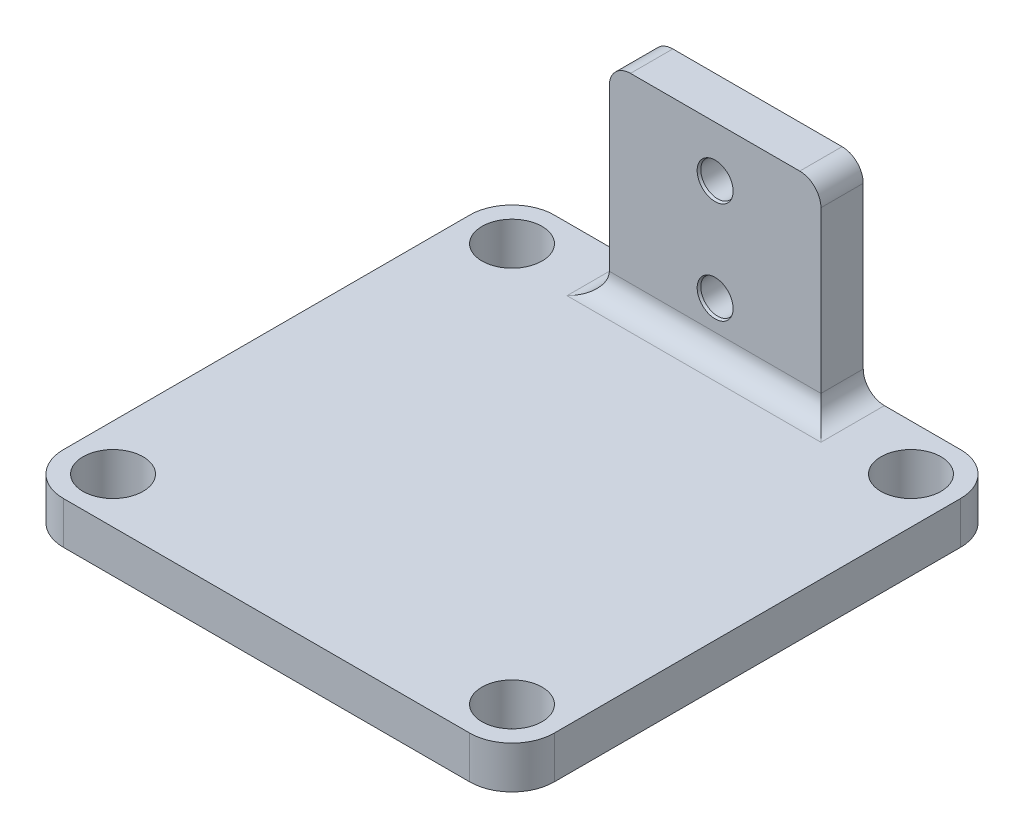
ISO-10303-21;
HEADER;
FILE_DESCRIPTION(('STEP AP214'),'2;1');
FILE_NAME('part.step','',(''),(''),'','','');
FILE_SCHEMA(('AUTOMOTIVE_DESIGN { 1 0 10303 214 1 1 1 1 }'));
ENDSEC;
DATA;
#1=APPLICATION_CONTEXT('core data for automotive mechanical design processes');
#2=APPLICATION_PROTOCOL_DEFINITION('international standard','automotive_design',2000,#1);
#3=PRODUCT_CONTEXT('',#1,'mechanical');
#4=PRODUCT('Part','Part','',(#3));
#5=PRODUCT_RELATED_PRODUCT_CATEGORY('part','',(#4));
#6=PRODUCT_DEFINITION_FORMATION('','',#4);
#7=PRODUCT_DEFINITION_CONTEXT('part definition',#1,'design');
#8=PRODUCT_DEFINITION('design','',#6,#7);
#9=PRODUCT_DEFINITION_SHAPE('','',#8);
#10=(LENGTH_UNIT() NAMED_UNIT(*) SI_UNIT(.MILLI.,.METRE.));
#11=(NAMED_UNIT(*) PLANE_ANGLE_UNIT() SI_UNIT($,.RADIAN.));
#12=(NAMED_UNIT(*) SI_UNIT($,.STERADIAN.) SOLID_ANGLE_UNIT());
#13=UNCERTAINTY_MEASURE_WITH_UNIT(LENGTH_MEASURE(1.E-05),#10,'distance_accuracy_value','');
#14=(GEOMETRIC_REPRESENTATION_CONTEXT(3) GLOBAL_UNCERTAINTY_ASSIGNED_CONTEXT((#13)) GLOBAL_UNIT_ASSIGNED_CONTEXT((#10,
#11,#12)) REPRESENTATION_CONTEXT('',''));
#15=CARTESIAN_POINT('',(0.,0.,0.));
#16=DIRECTION('',(0.,0.,1.));
#17=DIRECTION('',(1.,0.,0.));
#18=AXIS2_PLACEMENT_3D('',#15,#16,#17);
#19=CARTESIAN_POINT('',(0.,5.,0.));
#20=DIRECTION('',(0.,-1.,0.));
#21=DIRECTION('',(0.,0.,-1.));
#22=AXIS2_PLACEMENT_3D('',#19,#20,#21);
#23=PLANE('',#22);
#24=CARTESIAN_POINT('',(-23.57,5.,23.57));
#25=DIRECTION('',(0.,1.,0.));
#26=DIRECTION('',(0.,0.,1.));
#27=AXIS2_PLACEMENT_3D('',#24,#25,#26);
#28=CIRCLE('',#27,3.55);
#29=CARTESIAN_POINT('',(-23.57,5.,27.12));
#30=VERTEX_POINT('',#29);
#31=EDGE_CURVE('E303',#30,#30,#28,.T.);
#32=ORIENTED_EDGE('',*,*,#31,.F.);
#33=EDGE_LOOP('',(#32));
#34=FACE_BOUND('',#33,.T.);
#35=CARTESIAN_POINT('',(23.57,5.,23.57));
#36=DIRECTION('',(0.,1.,0.));
#37=DIRECTION('',(0.,0.,1.));
#38=AXIS2_PLACEMENT_3D('',#35,#36,#37);
#39=CIRCLE('',#38,3.55);
#40=CARTESIAN_POINT('',(23.57,5.,27.12));
#41=VERTEX_POINT('',#40);
#42=EDGE_CURVE('E309',#41,#41,#39,.T.);
#43=ORIENTED_EDGE('',*,*,#42,.F.);
#44=EDGE_LOOP('',(#43));
#45=FACE_BOUND('',#44,.T.);
#46=CARTESIAN_POINT('',(23.57,5.,-23.57));
#47=DIRECTION('',(0.,1.,0.));
#48=DIRECTION('',(0.,0.,1.));
#49=AXIS2_PLACEMENT_3D('',#46,#47,#48);
#50=CIRCLE('',#49,3.55);
#51=CARTESIAN_POINT('',(23.57,5.,-20.02));
#52=VERTEX_POINT('',#51);
#53=EDGE_CURVE('E315',#52,#52,#50,.T.);
#54=ORIENTED_EDGE('',*,*,#53,.F.);
#55=EDGE_LOOP('',(#54));
#56=FACE_BOUND('',#55,.T.);
#57=CARTESIAN_POINT('',(-23.57,5.,-23.57));
#58=DIRECTION('',(0.,1.,0.));
#59=DIRECTION('',(0.,0.,1.));
#60=AXIS2_PLACEMENT_3D('',#57,#58,#59);
#61=CIRCLE('',#60,3.55);
#62=CARTESIAN_POINT('',(-23.57,5.,-20.02));
#63=VERTEX_POINT('',#62);
#64=EDGE_CURVE('E194',#63,#63,#61,.T.);
#65=ORIENTED_EDGE('',*,*,#64,.F.);
#66=EDGE_LOOP('',(#65));
#67=FACE_BOUND('',#66,.T.);
#68=DIRECTION('',(-1.,0.,0.));
#69=VECTOR('',#68,1.);
#70=CARTESIAN_POINT('',(-29.,5.,-29.));
#71=LINE('',#70,#69);
#72=CARTESIAN_POINT('',(24.,5.,-29.));
#73=VERTEX_POINT('',#72);
#74=CARTESIAN_POINT('',(15.,5.,-29.));
#75=VERTEX_POINT('',#74);
#76=EDGE_CURVE('E181',#73,#75,#71,.T.);
#77=ORIENTED_EDGE('',*,*,#76,.T.);
#78=DIRECTION('',(0.,0.,-1.));
#79=VECTOR('',#78,1.);
#80=CARTESIAN_POINT('',(15.,5.,-24.));
#81=LINE('',#80,#79);
#82=CARTESIAN_POINT('',(15.,5.,-21.5));
#83=VERTEX_POINT('',#82);
#84=EDGE_CURVE('E239',#75,#83,#81,.F.);
#85=ORIENTED_EDGE('',*,*,#84,.T.);
#86=DIRECTION('',(1.,0.,0.));
#87=VECTOR('',#86,1.);
#88=CARTESIAN_POINT('',(0.,5.,-21.5));
#89=LINE('',#88,#87);
#90=CARTESIAN_POINT('',(-15.,5.,-21.5));
#91=VERTEX_POINT('',#90);
#92=EDGE_CURVE('E237',#83,#91,#89,.F.);
#93=ORIENTED_EDGE('',*,*,#92,.T.);
#94=DIRECTION('',(0.,0.,-1.));
#95=VECTOR('',#94,1.);
#96=CARTESIAN_POINT('',(-15.,5.,-29.));
#97=LINE('',#96,#95);
#98=CARTESIAN_POINT('',(-15.,5.,-29.));
#99=VERTEX_POINT('',#98);
#100=EDGE_CURVE('E235',#91,#99,#97,.T.);
#101=ORIENTED_EDGE('',*,*,#100,.T.);
#102=CARTESIAN_POINT('',(-24.,5.,-29.));
#103=VERTEX_POINT('',#102);
#104=EDGE_CURVE('E327',#99,#103,#71,.T.);
#105=ORIENTED_EDGE('',*,*,#104,.T.);
#106=CARTESIAN_POINT('',(-24.,5.,-24.));
#107=DIRECTION('',(0.,-1.,0.));
#108=DIRECTION('',(0.,0.,-1.));
#109=AXIS2_PLACEMENT_3D('',#106,#107,#108);
#110=CIRCLE('',#109,5.);
#111=CARTESIAN_POINT('',(-29.,5.,-24.));
#112=VERTEX_POINT('',#111);
#113=EDGE_CURVE('E214',#103,#112,#110,.F.);
#114=ORIENTED_EDGE('',*,*,#113,.T.);
#115=DIRECTION('',(0.,0.,1.));
#116=VECTOR('',#115,1.);
#117=CARTESIAN_POINT('',(-29.,5.,29.));
#118=LINE('',#117,#116);
#119=CARTESIAN_POINT('',(-29.,5.,24.));
#120=VERTEX_POINT('',#119);
#121=EDGE_CURVE('E329',#112,#120,#118,.T.);
#122=ORIENTED_EDGE('',*,*,#121,.T.);
#123=CARTESIAN_POINT('',(-24.,5.,24.));
#124=DIRECTION('',(0.,-1.,0.));
#125=DIRECTION('',(0.,0.,-1.));
#126=AXIS2_PLACEMENT_3D('',#123,#124,#125);
#127=CIRCLE('',#126,5.);
#128=CARTESIAN_POINT('',(-24.,5.,29.));
#129=VERTEX_POINT('',#128);
#130=EDGE_CURVE('E210',#120,#129,#127,.F.);
#131=ORIENTED_EDGE('',*,*,#130,.T.);
#132=DIRECTION('',(1.,0.,0.));
#133=VECTOR('',#132,1.);
#134=CARTESIAN_POINT('',(-29.,5.,29.));
#135=LINE('',#134,#133);
#136=CARTESIAN_POINT('',(24.,5.,29.));
#137=VERTEX_POINT('',#136);
#138=EDGE_CURVE('E201',#129,#137,#135,.T.);
#139=ORIENTED_EDGE('',*,*,#138,.T.);
#140=CARTESIAN_POINT('',(24.,5.,24.));
#141=DIRECTION('',(0.,-1.,0.));
#142=DIRECTION('',(0.,0.,-1.));
#143=AXIS2_PLACEMENT_3D('',#140,#141,#142);
#144=CIRCLE('',#143,5.);
#145=CARTESIAN_POINT('',(29.,5.,24.));
#146=VERTEX_POINT('',#145);
#147=EDGE_CURVE('E212',#137,#146,#144,.F.);
#148=ORIENTED_EDGE('',*,*,#147,.T.);
#149=DIRECTION('',(0.,0.,-1.));
#150=VECTOR('',#149,1.);
#151=CARTESIAN_POINT('',(29.,5.,29.));
#152=LINE('',#151,#150);
#153=CARTESIAN_POINT('',(29.,5.,-24.));
#154=VERTEX_POINT('',#153);
#155=EDGE_CURVE('E200',#146,#154,#152,.T.);
#156=ORIENTED_EDGE('',*,*,#155,.T.);
#157=CARTESIAN_POINT('',(24.,5.,-24.));
#158=DIRECTION('',(0.,-1.,0.));
#159=DIRECTION('',(0.,0.,-1.));
#160=AXIS2_PLACEMENT_3D('',#157,#158,#159);
#161=CIRCLE('',#160,5.);
#162=EDGE_CURVE('E216',#154,#73,#161,.F.);
#163=ORIENTED_EDGE('',*,*,#162,.T.);
#164=EDGE_LOOP('',(#77,#85,#93,#101,#105,#114,#122,#131,#139,#148,#156,#163));
#165=FACE_BOUND('',#164,.T.);
#166=ADVANCED_FACE('F45',(#34,#45,#56,#67,#165),#23,.F.);
#167=CARTESIAN_POINT('',(0.,0.,0.));
#168=DIRECTION('',(0.,-1.,0.));
#169=DIRECTION('',(0.,0.,-1.));
#170=AXIS2_PLACEMENT_3D('',#167,#168,#169);
#171=PLANE('',#170);
#172=CARTESIAN_POINT('',(23.57,0.,23.57));
#173=DIRECTION('',(0.,1.,0.));
#174=DIRECTION('',(0.,0.,1.));
#175=AXIS2_PLACEMENT_3D('',#172,#173,#174);
#176=CIRCLE('',#175,3.55);
#177=CARTESIAN_POINT('',(23.57,0.,27.12));
#178=VERTEX_POINT('',#177);
#179=EDGE_CURVE('E306',#178,#178,#176,.T.);
#180=ORIENTED_EDGE('',*,*,#179,.T.);
#181=EDGE_LOOP('',(#180));
#182=FACE_BOUND('',#181,.T.);
#183=CARTESIAN_POINT('',(-23.57,0.,-23.57));
#184=DIRECTION('',(0.,1.,0.));
#185=DIRECTION('',(0.,0.,1.));
#186=AXIS2_PLACEMENT_3D('',#183,#184,#185);
#187=CIRCLE('',#186,3.55);
#188=CARTESIAN_POINT('',(-23.57,0.,-20.02));
#189=VERTEX_POINT('',#188);
#190=EDGE_CURVE('E318',#189,#189,#187,.T.);
#191=ORIENTED_EDGE('',*,*,#190,.T.);
#192=EDGE_LOOP('',(#191));
#193=FACE_BOUND('',#192,.T.);
#194=DIRECTION('',(-1.,0.,0.));
#195=VECTOR('',#194,1.);
#196=CARTESIAN_POINT('',(-29.,0.,-29.));
#197=LINE('',#196,#195);
#198=CARTESIAN_POINT('',(24.,0.,-29.));
#199=VERTEX_POINT('',#198);
#200=CARTESIAN_POINT('',(-24.,0.,-29.));
#201=VERTEX_POINT('',#200);
#202=EDGE_CURVE('E178',#199,#201,#197,.T.);
#203=ORIENTED_EDGE('',*,*,#202,.F.);
#204=CARTESIAN_POINT('',(24.,0.,-24.));
#205=DIRECTION('',(0.,-1.,0.));
#206=DIRECTION('',(0.,0.,-1.));
#207=AXIS2_PLACEMENT_3D('',#204,#205,#206);
#208=CIRCLE('',#207,5.);
#209=CARTESIAN_POINT('',(29.,0.,-24.));
#210=VERTEX_POINT('',#209);
#211=EDGE_CURVE('E161',#199,#210,#208,.T.);
#212=ORIENTED_EDGE('',*,*,#211,.T.);
#213=DIRECTION('',(0.,0.,-1.));
#214=VECTOR('',#213,1.);
#215=CARTESIAN_POINT('',(29.,0.,29.));
#216=LINE('',#215,#214);
#217=CARTESIAN_POINT('',(29.,0.,24.));
#218=VERTEX_POINT('',#217);
#219=EDGE_CURVE('E189',#218,#210,#216,.T.);
#220=ORIENTED_EDGE('',*,*,#219,.F.);
#221=CARTESIAN_POINT('',(24.,0.,24.));
#222=DIRECTION('',(0.,-1.,0.));
#223=DIRECTION('',(0.,0.,-1.));
#224=AXIS2_PLACEMENT_3D('',#221,#222,#223);
#225=CIRCLE('',#224,5.);
#226=CARTESIAN_POINT('',(24.,0.,29.));
#227=VERTEX_POINT('',#226);
#228=EDGE_CURVE('E204',#218,#227,#225,.T.);
#229=ORIENTED_EDGE('',*,*,#228,.T.);
#230=DIRECTION('',(1.,0.,0.));
#231=VECTOR('',#230,1.);
#232=CARTESIAN_POINT('',(-29.,0.,29.));
#233=LINE('',#232,#231);
#234=CARTESIAN_POINT('',(-24.,0.,29.));
#235=VERTEX_POINT('',#234);
#236=EDGE_CURVE('E192',#235,#227,#233,.T.);
#237=ORIENTED_EDGE('',*,*,#236,.F.);
#238=CARTESIAN_POINT('',(-24.,0.,24.));
#239=DIRECTION('',(0.,-1.,0.));
#240=DIRECTION('',(0.,0.,-1.));
#241=AXIS2_PLACEMENT_3D('',#238,#239,#240);
#242=CIRCLE('',#241,5.);
#243=CARTESIAN_POINT('',(-29.,0.,24.));
#244=VERTEX_POINT('',#243);
#245=EDGE_CURVE('E182',#235,#244,#242,.T.);
#246=ORIENTED_EDGE('',*,*,#245,.T.);
#247=DIRECTION('',(0.,0.,1.));
#248=VECTOR('',#247,1.);
#249=CARTESIAN_POINT('',(-29.,0.,29.));
#250=LINE('',#249,#248);
#251=CARTESIAN_POINT('',(-29.,0.,-24.));
#252=VERTEX_POINT('',#251);
#253=EDGE_CURVE('E188',#252,#244,#250,.T.);
#254=ORIENTED_EDGE('',*,*,#253,.F.);
#255=CARTESIAN_POINT('',(-24.,0.,-24.));
#256=DIRECTION('',(0.,-1.,0.));
#257=DIRECTION('',(0.,0.,-1.));
#258=AXIS2_PLACEMENT_3D('',#255,#256,#257);
#259=CIRCLE('',#258,5.);
#260=EDGE_CURVE('E172',#252,#201,#259,.T.);
#261=ORIENTED_EDGE('',*,*,#260,.T.);
#262=EDGE_LOOP('',(#203,#212,#220,#229,#237,#246,#254,#261));
#263=FACE_BOUND('',#262,.T.);
#264=CARTESIAN_POINT('',(23.57,0.,-23.57));
#265=DIRECTION('',(0.,1.,0.));
#266=DIRECTION('',(0.,0.,1.));
#267=AXIS2_PLACEMENT_3D('',#264,#265,#266);
#268=CIRCLE('',#267,3.55);
#269=CARTESIAN_POINT('',(23.57,0.,-20.02));
#270=VERTEX_POINT('',#269);
#271=EDGE_CURVE('E312',#270,#270,#268,.T.);
#272=ORIENTED_EDGE('',*,*,#271,.T.);
#273=EDGE_LOOP('',(#272));
#274=FACE_BOUND('',#273,.T.);
#275=CARTESIAN_POINT('',(-23.57,0.,23.57));
#276=DIRECTION('',(0.,1.,0.));
#277=DIRECTION('',(0.,0.,1.));
#278=AXIS2_PLACEMENT_3D('',#275,#276,#277);
#279=CIRCLE('',#278,3.55);
#280=CARTESIAN_POINT('',(-23.57,0.,27.12));
#281=VERTEX_POINT('',#280);
#282=EDGE_CURVE('E296',#281,#281,#279,.T.);
#283=ORIENTED_EDGE('',*,*,#282,.T.);
#284=EDGE_LOOP('',(#283));
#285=FACE_BOUND('',#284,.T.);
#286=ADVANCED_FACE('F185',(#182,#193,#263,#274,#285),#171,.T.);
#287=CARTESIAN_POINT('',(29.,5.,29.));
#288=DIRECTION('',(-1.,0.,0.));
#289=DIRECTION('',(0.,0.,1.));
#290=AXIS2_PLACEMENT_3D('',#287,#288,#289);
#291=PLANE('',#290);
#292=ORIENTED_EDGE('',*,*,#219,.T.);
#293=DIRECTION('',(0.,-1.,0.));
#294=VECTOR('',#293,1.);
#295=CARTESIAN_POINT('',(29.,5.,-24.));
#296=LINE('',#295,#294);
#297=EDGE_CURVE('E166',#210,#154,#296,.F.);
#298=ORIENTED_EDGE('',*,*,#297,.T.);
#299=ORIENTED_EDGE('',*,*,#155,.F.);
#300=DIRECTION('',(0.,-1.,0.));
#301=VECTOR('',#300,1.);
#302=CARTESIAN_POINT('',(29.,5.,24.));
#303=LINE('',#302,#301);
#304=EDGE_CURVE('E171',#146,#218,#303,.T.);
#305=ORIENTED_EDGE('',*,*,#304,.T.);
#306=EDGE_LOOP('',(#292,#298,#299,#305));
#307=FACE_BOUND('',#306,.T.);
#308=ADVANCED_FACE('F344',(#307),#291,.F.);
#309=CARTESIAN_POINT('',(-29.,5.,-29.));
#310=DIRECTION('',(0.,0.,1.));
#311=DIRECTION('',(1.,0.,0.));
#312=AXIS2_PLACEMENT_3D('',#309,#310,#311);
#313=PLANE('',#312);
#314=CARTESIAN_POINT('',(0.,23.,-29.));
#315=DIRECTION('',(0.,0.,1.));
#316=DIRECTION('',(1.,0.,0.));
#317=AXIS2_PLACEMENT_3D('',#314,#315,#316);
#318=CIRCLE('',#317,2.);
#319=CARTESIAN_POINT('',(2.,23.,-29.));
#320=VERTEX_POINT('',#319);
#321=EDGE_CURVE('E271',#320,#320,#318,.T.);
#322=ORIENTED_EDGE('',*,*,#321,.T.);
#323=EDGE_LOOP('',(#322));
#324=FACE_BOUND('',#323,.T.);
#325=CARTESIAN_POINT('',(0.,11.,-29.));
#326=DIRECTION('',(0.,0.,1.));
#327=DIRECTION('',(1.,0.,0.));
#328=AXIS2_PLACEMENT_3D('',#325,#326,#327);
#329=CIRCLE('',#328,2.);
#330=CARTESIAN_POINT('',(2.,11.,-29.));
#331=VERTEX_POINT('',#330);
#332=EDGE_CURVE('E282',#331,#331,#329,.T.);
#333=ORIENTED_EDGE('',*,*,#332,.T.);
#334=EDGE_LOOP('',(#333));
#335=FACE_BOUND('',#334,.T.);
#336=DIRECTION('',(-1.,0.,0.));
#337=VECTOR('',#336,1.);
#338=CARTESIAN_POINT('',(-29.,29.,-29.));
#339=LINE('',#338,#337);
#340=CARTESIAN_POINT('',(9.99999999999999,29.,-29.));
#341=VERTEX_POINT('',#340);
#342=CARTESIAN_POINT('',(-10.,29.,-29.));
#343=VERTEX_POINT('',#342);
#344=EDGE_CURVE('E299',#341,#343,#339,.T.);
#345=ORIENTED_EDGE('',*,*,#344,.F.);
#346=CARTESIAN_POINT('',(9.99999999999999,26.5,-29.));
#347=DIRECTION('',(0.,0.,1.));
#348=DIRECTION('',(1.,0.,0.));
#349=AXIS2_PLACEMENT_3D('',#346,#347,#348);
#350=CIRCLE('',#349,2.5);
#351=CARTESIAN_POINT('',(12.5,26.5,-29.));
#352=VERTEX_POINT('',#351);
#353=EDGE_CURVE('E70',#341,#352,#350,.F.);
#354=ORIENTED_EDGE('',*,*,#353,.T.);
#355=DIRECTION('',(0.,1.,0.));
#356=VECTOR('',#355,1.);
#357=CARTESIAN_POINT('',(12.5,5.,-29.));
#358=LINE('',#357,#356);
#359=CARTESIAN_POINT('',(12.5,7.5,-29.));
#360=VERTEX_POINT('',#359);
#361=EDGE_CURVE('E285',#360,#352,#358,.T.);
#362=ORIENTED_EDGE('',*,*,#361,.F.);
#363=CARTESIAN_POINT('',(15.,7.5,-29.));
#364=DIRECTION('',(0.,0.,1.));
#365=DIRECTION('',(1.,0.,0.));
#366=AXIS2_PLACEMENT_3D('',#363,#364,#365);
#367=CIRCLE('',#366,2.5);
#368=EDGE_CURVE('E54',#360,#75,#367,.T.);
#369=ORIENTED_EDGE('',*,*,#368,.T.);
#370=ORIENTED_EDGE('',*,*,#76,.F.);
#371=DIRECTION('',(0.,-1.,0.));
#372=VECTOR('',#371,1.);
#373=CARTESIAN_POINT('',(24.,5.,-29.));
#374=LINE('',#373,#372);
#375=EDGE_CURVE('E165',#73,#199,#374,.T.);
#376=ORIENTED_EDGE('',*,*,#375,.T.);
#377=ORIENTED_EDGE('',*,*,#202,.T.);
#378=DIRECTION('',(0.,-1.,0.));
#379=VECTOR('',#378,1.);
#380=CARTESIAN_POINT('',(-24.,5.,-29.));
#381=LINE('',#380,#379);
#382=EDGE_CURVE('E183',#201,#103,#381,.F.);
#383=ORIENTED_EDGE('',*,*,#382,.T.);
#384=ORIENTED_EDGE('',*,*,#104,.F.);
#385=CARTESIAN_POINT('',(-15.,7.5,-29.));
#386=DIRECTION('',(0.,0.,1.));
#387=DIRECTION('',(1.,0.,0.));
#388=AXIS2_PLACEMENT_3D('',#385,#386,#387);
#389=CIRCLE('',#388,2.5);
#390=CARTESIAN_POINT('',(-12.5,7.5,-29.));
#391=VERTEX_POINT('',#390);
#392=EDGE_CURVE('E11',#99,#391,#389,.T.);
#393=ORIENTED_EDGE('',*,*,#392,.T.);
#394=DIRECTION('',(0.,-1.,0.));
#395=VECTOR('',#394,1.);
#396=CARTESIAN_POINT('',(-12.5,5.,-29.));
#397=LINE('',#396,#395);
#398=CARTESIAN_POINT('',(-12.5,26.5,-29.));
#399=VERTEX_POINT('',#398);
#400=EDGE_CURVE('E290',#399,#391,#397,.T.);
#401=ORIENTED_EDGE('',*,*,#400,.F.);
#402=CARTESIAN_POINT('',(-10.,26.5,-29.));
#403=DIRECTION('',(0.,0.,1.));
#404=DIRECTION('',(1.,0.,0.));
#405=AXIS2_PLACEMENT_3D('',#402,#403,#404);
#406=CIRCLE('',#405,2.5);
#407=EDGE_CURVE('E62',#399,#343,#406,.F.);
#408=ORIENTED_EDGE('',*,*,#407,.T.);
#409=EDGE_LOOP('',(#345,#354,#362,#369,#370,#376,#377,#383,#384,#393,#401,#408));
#410=FACE_BOUND('',#409,.T.);
#411=ADVANCED_FACE('F176',(#324,#335,#410),#313,.F.);
#412=CARTESIAN_POINT('',(-29.,5.,29.));
#413=DIRECTION('',(1.,0.,0.));
#414=DIRECTION('',(0.,0.,-1.));
#415=AXIS2_PLACEMENT_3D('',#412,#413,#414);
#416=PLANE('',#415);
#417=ORIENTED_EDGE('',*,*,#121,.F.);
#418=DIRECTION('',(0.,-1.,0.));
#419=VECTOR('',#418,1.);
#420=CARTESIAN_POINT('',(-29.,5.,-24.));
#421=LINE('',#420,#419);
#422=EDGE_CURVE('E220',#112,#252,#421,.T.);
#423=ORIENTED_EDGE('',*,*,#422,.T.);
#424=ORIENTED_EDGE('',*,*,#253,.T.);
#425=DIRECTION('',(0.,-1.,0.));
#426=VECTOR('',#425,1.);
#427=CARTESIAN_POINT('',(-29.,5.,24.));
#428=LINE('',#427,#426);
#429=EDGE_CURVE('E218',#244,#120,#428,.F.);
#430=ORIENTED_EDGE('',*,*,#429,.T.);
#431=EDGE_LOOP('',(#417,#423,#424,#430));
#432=FACE_BOUND('',#431,.T.);
#433=ADVANCED_FACE('F352',(#432),#416,.F.);
#434=CARTESIAN_POINT('',(-29.,5.,29.));
#435=DIRECTION('',(0.,0.,-1.));
#436=DIRECTION('',(-1.,0.,0.));
#437=AXIS2_PLACEMENT_3D('',#434,#435,#436);
#438=PLANE('',#437);
#439=ORIENTED_EDGE('',*,*,#236,.T.);
#440=DIRECTION('',(0.,-1.,0.));
#441=VECTOR('',#440,1.);
#442=CARTESIAN_POINT('',(24.,5.,29.));
#443=LINE('',#442,#441);
#444=EDGE_CURVE('E226',#227,#137,#443,.F.);
#445=ORIENTED_EDGE('',*,*,#444,.T.);
#446=ORIENTED_EDGE('',*,*,#138,.F.);
#447=DIRECTION('',(0.,-1.,0.));
#448=VECTOR('',#447,1.);
#449=CARTESIAN_POINT('',(-24.,5.,29.));
#450=LINE('',#449,#448);
#451=EDGE_CURVE('E223',#129,#235,#450,.T.);
#452=ORIENTED_EDGE('',*,*,#451,.T.);
#453=EDGE_LOOP('',(#439,#445,#446,#452));
#454=FACE_BOUND('',#453,.T.);
#455=ADVANCED_FACE('F346',(#454),#438,.F.);
#456=CARTESIAN_POINT('',(-23.57,5.,-23.57));
#457=DIRECTION('',(0.,-1.,0.));
#458=DIRECTION('',(0.,0.,-1.));
#459=AXIS2_PLACEMENT_3D('',#456,#457,#458);
#460=CYLINDRICAL_SURFACE('',#459,3.55);
#461=ORIENTED_EDGE('',*,*,#64,.T.);
#462=EDGE_LOOP('',(#461));
#463=FACE_BOUND('',#462,.T.);
#464=ORIENTED_EDGE('',*,*,#190,.F.);
#465=EDGE_LOOP('',(#464));
#466=FACE_BOUND('',#465,.T.);
#467=ADVANCED_FACE('F404',(#463,#466),#460,.F.);
#468=CARTESIAN_POINT('',(23.57,5.,-23.57));
#469=DIRECTION('',(0.,-1.,0.));
#470=DIRECTION('',(0.,0.,-1.));
#471=AXIS2_PLACEMENT_3D('',#468,#469,#470);
#472=CYLINDRICAL_SURFACE('',#471,3.55);
#473=ORIENTED_EDGE('',*,*,#53,.T.);
#474=EDGE_LOOP('',(#473));
#475=FACE_BOUND('',#474,.T.);
#476=ORIENTED_EDGE('',*,*,#271,.F.);
#477=EDGE_LOOP('',(#476));
#478=FACE_BOUND('',#477,.T.);
#479=ADVANCED_FACE('F462',(#475,#478),#472,.F.);
#480=CARTESIAN_POINT('',(23.57,5.,23.57));
#481=DIRECTION('',(0.,-1.,0.));
#482=DIRECTION('',(0.,0.,-1.));
#483=AXIS2_PLACEMENT_3D('',#480,#481,#482);
#484=CYLINDRICAL_SURFACE('',#483,3.55);
#485=ORIENTED_EDGE('',*,*,#42,.T.);
#486=EDGE_LOOP('',(#485));
#487=FACE_BOUND('',#486,.T.);
#488=ORIENTED_EDGE('',*,*,#179,.F.);
#489=EDGE_LOOP('',(#488));
#490=FACE_BOUND('',#489,.T.);
#491=ADVANCED_FACE('F459',(#487,#490),#484,.F.);
#492=CARTESIAN_POINT('',(-23.57,5.,23.57));
#493=DIRECTION('',(0.,-1.,0.));
#494=DIRECTION('',(0.,0.,-1.));
#495=AXIS2_PLACEMENT_3D('',#492,#493,#494);
#496=CYLINDRICAL_SURFACE('',#495,3.55);
#497=ORIENTED_EDGE('',*,*,#31,.T.);
#498=EDGE_LOOP('',(#497));
#499=FACE_BOUND('',#498,.T.);
#500=ORIENTED_EDGE('',*,*,#282,.F.);
#501=EDGE_LOOP('',(#500));
#502=FACE_BOUND('',#501,.T.);
#503=ADVANCED_FACE('F417',(#499,#502),#496,.F.);
#504=CARTESIAN_POINT('',(24.,5.,-24.));
#505=DIRECTION('',(0.,-1.,0.));
#506=DIRECTION('',(0.,0.,-1.));
#507=AXIS2_PLACEMENT_3D('',#504,#505,#506);
#508=CYLINDRICAL_SURFACE('',#507,5.);
#509=ORIENTED_EDGE('',*,*,#162,.F.);
#510=ORIENTED_EDGE('',*,*,#297,.F.);
#511=ORIENTED_EDGE('',*,*,#211,.F.);
#512=ORIENTED_EDGE('',*,*,#375,.F.);
#513=EDGE_LOOP('',(#509,#510,#511,#512));
#514=FACE_BOUND('',#513,.T.);
#515=ADVANCED_FACE('F164',(#514),#508,.T.);
#516=CARTESIAN_POINT('',(-24.,5.,-24.));
#517=DIRECTION('',(0.,-1.,0.));
#518=DIRECTION('',(0.,0.,-1.));
#519=AXIS2_PLACEMENT_3D('',#516,#517,#518);
#520=CYLINDRICAL_SURFACE('',#519,5.);
#521=ORIENTED_EDGE('',*,*,#113,.F.);
#522=ORIENTED_EDGE('',*,*,#382,.F.);
#523=ORIENTED_EDGE('',*,*,#260,.F.);
#524=ORIENTED_EDGE('',*,*,#422,.F.);
#525=EDGE_LOOP('',(#521,#522,#523,#524));
#526=FACE_BOUND('',#525,.T.);
#527=ADVANCED_FACE('F356',(#526),#520,.T.);
#528=CARTESIAN_POINT('',(24.,5.,24.));
#529=DIRECTION('',(0.,-1.,0.));
#530=DIRECTION('',(0.,0.,-1.));
#531=AXIS2_PLACEMENT_3D('',#528,#529,#530);
#532=CYLINDRICAL_SURFACE('',#531,5.);
#533=ORIENTED_EDGE('',*,*,#147,.F.);
#534=ORIENTED_EDGE('',*,*,#444,.F.);
#535=ORIENTED_EDGE('',*,*,#228,.F.);
#536=ORIENTED_EDGE('',*,*,#304,.F.);
#537=EDGE_LOOP('',(#533,#534,#535,#536));
#538=FACE_BOUND('',#537,.T.);
#539=ADVANCED_FACE('F342',(#538),#532,.T.);
#540=CARTESIAN_POINT('',(-24.,5.,24.));
#541=DIRECTION('',(0.,-1.,0.));
#542=DIRECTION('',(0.,0.,-1.));
#543=AXIS2_PLACEMENT_3D('',#540,#541,#542);
#544=CYLINDRICAL_SURFACE('',#543,5.);
#545=ORIENTED_EDGE('',*,*,#130,.F.);
#546=ORIENTED_EDGE('',*,*,#429,.F.);
#547=ORIENTED_EDGE('',*,*,#245,.F.);
#548=ORIENTED_EDGE('',*,*,#451,.F.);
#549=EDGE_LOOP('',(#545,#546,#547,#548));
#550=FACE_BOUND('',#549,.T.);
#551=ADVANCED_FACE('F348',(#550),#544,.T.);
#552=CARTESIAN_POINT('',(12.5,5.,-24.));
#553=DIRECTION('',(-1.,0.,0.));
#554=DIRECTION('',(0.,0.,1.));
#555=AXIS2_PLACEMENT_3D('',#552,#553,#554);
#556=PLANE('',#555);
#557=DIRECTION('',(0.,1.,0.));
#558=VECTOR('',#557,1.);
#559=CARTESIAN_POINT('',(12.5,5.,-24.));
#560=LINE('',#559,#558);
#561=CARTESIAN_POINT('',(12.5,7.5,-24.));
#562=VERTEX_POINT('',#561);
#563=CARTESIAN_POINT('',(12.5,26.5,-24.));
#564=VERTEX_POINT('',#563);
#565=EDGE_CURVE('E286',#562,#564,#560,.T.);
#566=ORIENTED_EDGE('',*,*,#565,.F.);
#567=DIRECTION('',(0.,0.,-1.));
#568=VECTOR('',#567,1.);
#569=CARTESIAN_POINT('',(12.5,7.5,-29.));
#570=LINE('',#569,#568);
#571=EDGE_CURVE('E243',#562,#360,#570,.T.);
#572=ORIENTED_EDGE('',*,*,#571,.T.);
#573=ORIENTED_EDGE('',*,*,#361,.T.);
#574=DIRECTION('',(0.,0.,-1.));
#575=VECTOR('',#574,1.);
#576=CARTESIAN_POINT('',(12.5,26.5,-24.));
#577=LINE('',#576,#575);
#578=EDGE_CURVE('E241',#352,#564,#577,.F.);
#579=ORIENTED_EDGE('',*,*,#578,.T.);
#580=EDGE_LOOP('',(#566,#572,#573,#579));
#581=FACE_BOUND('',#580,.T.);
#582=ADVANCED_FACE('F379',(#581),#556,.F.);
#583=CARTESIAN_POINT('',(-29.,29.,-24.));
#584=DIRECTION('',(0.,-1.,0.));
#585=DIRECTION('',(1.,0.,0.));
#586=AXIS2_PLACEMENT_3D('',#583,#584,#585);
#587=PLANE('',#586);
#588=DIRECTION('',(-1.,0.,0.));
#589=VECTOR('',#588,1.);
#590=CARTESIAN_POINT('',(-29.,29.,-24.));
#591=LINE('',#590,#589);
#592=CARTESIAN_POINT('',(9.99999999999999,29.,-24.));
#593=VERTEX_POINT('',#592);
#594=CARTESIAN_POINT('',(-10.,29.,-24.));
#595=VERTEX_POINT('',#594);
#596=EDGE_CURVE('E289',#593,#595,#591,.T.);
#597=ORIENTED_EDGE('',*,*,#596,.F.);
#598=DIRECTION('',(0.,0.,-1.));
#599=VECTOR('',#598,1.);
#600=CARTESIAN_POINT('',(9.99999999999999,29.,-24.));
#601=LINE('',#600,#599);
#602=EDGE_CURVE('E252',#593,#341,#601,.T.);
#603=ORIENTED_EDGE('',*,*,#602,.T.);
#604=ORIENTED_EDGE('',*,*,#344,.T.);
#605=DIRECTION('',(0.,0.,-1.));
#606=VECTOR('',#605,1.);
#607=CARTESIAN_POINT('',(-10.,29.,-24.));
#608=LINE('',#607,#606);
#609=EDGE_CURVE('E250',#343,#595,#608,.F.);
#610=ORIENTED_EDGE('',*,*,#609,.T.);
#611=EDGE_LOOP('',(#597,#603,#604,#610));
#612=FACE_BOUND('',#611,.T.);
#613=ADVANCED_FACE('F375',(#612),#587,.F.);
#614=CARTESIAN_POINT('',(-12.5,5.,-24.));
#615=DIRECTION('',(1.,0.,0.));
#616=DIRECTION('',(0.,1.,0.));
#617=AXIS2_PLACEMENT_3D('',#614,#615,#616);
#618=PLANE('',#617);
#619=ORIENTED_EDGE('',*,*,#400,.T.);
#620=DIRECTION('',(0.,0.,-1.));
#621=VECTOR('',#620,1.);
#622=CARTESIAN_POINT('',(-12.5,7.5,-24.));
#623=LINE('',#622,#621);
#624=CARTESIAN_POINT('',(-12.5,7.5,-24.));
#625=VERTEX_POINT('',#624);
#626=EDGE_CURVE('E248',#391,#625,#623,.F.);
#627=ORIENTED_EDGE('',*,*,#626,.T.);
#628=DIRECTION('',(0.,-1.,0.));
#629=VECTOR('',#628,1.);
#630=CARTESIAN_POINT('',(-12.5,5.,-24.));
#631=LINE('',#630,#629);
#632=CARTESIAN_POINT('',(-12.5,26.5,-24.));
#633=VERTEX_POINT('',#632);
#634=EDGE_CURVE('E293',#633,#625,#631,.T.);
#635=ORIENTED_EDGE('',*,*,#634,.F.);
#636=DIRECTION('',(0.,0.,-1.));
#637=VECTOR('',#636,1.);
#638=CARTESIAN_POINT('',(-12.5,26.5,-24.));
#639=LINE('',#638,#637);
#640=EDGE_CURVE('E245',#633,#399,#639,.T.);
#641=ORIENTED_EDGE('',*,*,#640,.T.);
#642=EDGE_LOOP('',(#619,#627,#635,#641));
#643=FACE_BOUND('',#642,.T.);
#644=ADVANCED_FACE('F365',(#643),#618,.F.);
#645=CARTESIAN_POINT('',(0.,0.,-24.));
#646=DIRECTION('',(0.,0.,1.));
#647=DIRECTION('',(1.,0.,0.));
#648=AXIS2_PLACEMENT_3D('',#645,#646,#647);
#649=PLANE('',#648);
#650=CARTESIAN_POINT('',(0.,23.,-24.));
#651=DIRECTION('',(0.,0.,1.));
#652=DIRECTION('',(1.,0.,0.));
#653=AXIS2_PLACEMENT_3D('',#650,#651,#652);
#654=CIRCLE('',#653,2.125);
#655=CARTESIAN_POINT('',(2.125,23.,-24.));
#656=VERTEX_POINT('',#655);
#657=EDGE_CURVE('E263',#656,#656,#654,.T.);
#658=ORIENTED_EDGE('',*,*,#657,.F.);
#659=EDGE_LOOP('',(#658));
#660=FACE_BOUND('',#659,.T.);
#661=CARTESIAN_POINT('',(0.,11.,-24.));
#662=DIRECTION('',(0.,0.,1.));
#663=DIRECTION('',(1.,0.,0.));
#664=AXIS2_PLACEMENT_3D('',#661,#662,#663);
#665=CIRCLE('',#664,2.125);
#666=CARTESIAN_POINT('',(2.125,11.,-24.));
#667=VERTEX_POINT('',#666);
#668=EDGE_CURVE('E276',#667,#667,#665,.T.);
#669=ORIENTED_EDGE('',*,*,#668,.F.);
#670=EDGE_LOOP('',(#669));
#671=FACE_BOUND('',#670,.T.);
#672=ORIENTED_EDGE('',*,*,#634,.T.);
#673=DIRECTION('',(1.,0.,0.));
#674=VECTOR('',#673,1.);
#675=CARTESIAN_POINT('',(0.,7.5,-24.));
#676=LINE('',#675,#674);
#677=EDGE_CURVE('E232',#625,#562,#676,.T.);
#678=ORIENTED_EDGE('',*,*,#677,.T.);
#679=ORIENTED_EDGE('',*,*,#565,.T.);
#680=CARTESIAN_POINT('',(9.99999999999999,26.5,-24.));
#681=DIRECTION('',(0.,0.,1.));
#682=DIRECTION('',(1.,0.,0.));
#683=AXIS2_PLACEMENT_3D('',#680,#681,#682);
#684=CIRCLE('',#683,2.5);
#685=EDGE_CURVE('E230',#564,#593,#684,.T.);
#686=ORIENTED_EDGE('',*,*,#685,.T.);
#687=ORIENTED_EDGE('',*,*,#596,.T.);
#688=CARTESIAN_POINT('',(-10.,26.5,-24.));
#689=DIRECTION('',(0.,0.,1.));
#690=DIRECTION('',(1.,0.,0.));
#691=AXIS2_PLACEMENT_3D('',#688,#689,#690);
#692=CIRCLE('',#691,2.5);
#693=EDGE_CURVE('E228',#595,#633,#692,.T.);
#694=ORIENTED_EDGE('',*,*,#693,.T.);
#695=EDGE_LOOP('',(#672,#678,#679,#686,#687,#694));
#696=FACE_BOUND('',#695,.T.);
#697=ADVANCED_FACE('F368',(#660,#671,#696),#649,.T.);
#698=CARTESIAN_POINT('',(0.,11.,-24.));
#699=DIRECTION('',(0.,0.,1.));
#700=DIRECTION('',(1.,0.,0.));
#701=AXIS2_PLACEMENT_3D('',#698,#699,#700);
#702=CYLINDRICAL_SURFACE('',#701,2.);
#703=ORIENTED_EDGE('',*,*,#332,.F.);
#704=EDGE_LOOP('',(#703));
#705=FACE_BOUND('',#704,.T.);
#706=CARTESIAN_POINT('',(0.,11.,-24.3017766952966));
#707=DIRECTION('',(0.,0.,1.));
#708=DIRECTION('',(1.,0.,0.));
#709=AXIS2_PLACEMENT_3D('',#706,#707,#708);
#710=CIRCLE('',#709,2.);
#711=CARTESIAN_POINT('',(2.,11.,-24.3017766952966));
#712=VERTEX_POINT('',#711);
#713=EDGE_CURVE('E279',#712,#712,#710,.T.);
#714=ORIENTED_EDGE('',*,*,#713,.T.);
#715=EDGE_LOOP('',(#714));
#716=FACE_BOUND('',#715,.T.);
#717=ADVANCED_FACE('F444',(#705,#716),#702,.F.);
#718=CARTESIAN_POINT('',(0.,11.,-24.));
#719=DIRECTION('',(0.,0.,1.));
#720=DIRECTION('',(1.,0.,0.));
#721=AXIS2_PLACEMENT_3D('',#718,#719,#720);
#722=CONICAL_SURFACE('',#721,2.125,0.392699081698722);
#723=ORIENTED_EDGE('',*,*,#713,.F.);
#724=EDGE_LOOP('',(#723));
#725=FACE_BOUND('',#724,.T.);
#726=ORIENTED_EDGE('',*,*,#668,.T.);
#727=EDGE_LOOP('',(#726));
#728=FACE_BOUND('',#727,.T.);
#729=ADVANCED_FACE('F437',(#725,#728),#722,.F.);
#730=CARTESIAN_POINT('',(0.,23.,-24.));
#731=DIRECTION('',(0.,0.,1.));
#732=DIRECTION('',(1.,0.,0.));
#733=AXIS2_PLACEMENT_3D('',#730,#731,#732);
#734=CYLINDRICAL_SURFACE('',#733,2.);
#735=ORIENTED_EDGE('',*,*,#321,.F.);
#736=EDGE_LOOP('',(#735));
#737=FACE_BOUND('',#736,.T.);
#738=CARTESIAN_POINT('',(0.,23.,-24.3017766952966));
#739=DIRECTION('',(0.,0.,1.));
#740=DIRECTION('',(1.,0.,0.));
#741=AXIS2_PLACEMENT_3D('',#738,#739,#740);
#742=CIRCLE('',#741,2.);
#743=CARTESIAN_POINT('',(2.,23.,-24.3017766952966));
#744=VERTEX_POINT('',#743);
#745=EDGE_CURVE('E266',#744,#744,#742,.T.);
#746=ORIENTED_EDGE('',*,*,#745,.T.);
#747=EDGE_LOOP('',(#746));
#748=FACE_BOUND('',#747,.T.);
#749=ADVANCED_FACE('F431',(#737,#748),#734,.F.);
#750=CARTESIAN_POINT('',(0.,23.,-24.));
#751=DIRECTION('',(0.,0.,1.));
#752=DIRECTION('',(1.,0.,0.));
#753=AXIS2_PLACEMENT_3D('',#750,#751,#752);
#754=CONICAL_SURFACE('',#753,2.125,0.392699081698722);
#755=ORIENTED_EDGE('',*,*,#745,.F.);
#756=EDGE_LOOP('',(#755));
#757=FACE_BOUND('',#756,.T.);
#758=ORIENTED_EDGE('',*,*,#657,.T.);
#759=EDGE_LOOP('',(#758));
#760=FACE_BOUND('',#759,.T.);
#761=ADVANCED_FACE('F427',(#757,#760),#754,.F.);
#762=CARTESIAN_POINT('',(-15.,7.5,0.));
#763=DIRECTION('',(0.,0.,1.));
#764=DIRECTION('',(1.,0.,0.));
#765=AXIS2_PLACEMENT_3D('',#762,#763,#764);
#766=CYLINDRICAL_SURFACE('',#765,2.5);
#767=ORIENTED_EDGE('',*,*,#392,.F.);
#768=ORIENTED_EDGE('',*,*,#100,.F.);
#769=CARTESIAN_POINT('',(-15.,7.5,-21.5));
#770=DIRECTION('',(0.707106781186547,0.,0.707106781186547));
#771=DIRECTION('',(-0.707106781186547,0.,0.707106781186547));
#772=AXIS2_PLACEMENT_3D('',#769,#770,#771);
#773=ELLIPSE('',#772,3.53553390593274,2.5);
#774=EDGE_CURVE('E49',#625,#91,#773,.F.);
#775=ORIENTED_EDGE('',*,*,#774,.F.);
#776=ORIENTED_EDGE('',*,*,#626,.F.);
#777=EDGE_LOOP('',(#767,#768,#775,#776));
#778=FACE_BOUND('',#777,.T.);
#779=ADVANCED_FACE('F362',(#778),#766,.F.);
#780=CARTESIAN_POINT('',(15.,7.5,-24.));
#781=DIRECTION('',(0.,0.,1.));
#782=DIRECTION('',(1.,0.,0.));
#783=AXIS2_PLACEMENT_3D('',#780,#781,#782);
#784=CYLINDRICAL_SURFACE('',#783,2.5);
#785=ORIENTED_EDGE('',*,*,#368,.F.);
#786=ORIENTED_EDGE('',*,*,#571,.F.);
#787=CARTESIAN_POINT('',(15.,7.5,-21.5));
#788=DIRECTION('',(-0.707106781186547,0.,0.707106781186547));
#789=DIRECTION('',(0.707106781186547,0.,0.707106781186547));
#790=AXIS2_PLACEMENT_3D('',#787,#788,#789);
#791=ELLIPSE('',#790,3.53553390593274,2.5);
#792=EDGE_CURVE('E256',#83,#562,#791,.F.);
#793=ORIENTED_EDGE('',*,*,#792,.F.);
#794=ORIENTED_EDGE('',*,*,#84,.F.);
#795=EDGE_LOOP('',(#785,#786,#793,#794));
#796=FACE_BOUND('',#795,.T.);
#797=ADVANCED_FACE('F388',(#796),#784,.F.);
#798=CARTESIAN_POINT('',(0.,7.5,-21.5));
#799=DIRECTION('',(1.,0.,0.));
#800=DIRECTION('',(0.,0.,-1.));
#801=AXIS2_PLACEMENT_3D('',#798,#799,#800);
#802=CYLINDRICAL_SURFACE('',#801,2.5);
#803=ORIENTED_EDGE('',*,*,#774,.T.);
#804=ORIENTED_EDGE('',*,*,#92,.F.);
#805=ORIENTED_EDGE('',*,*,#792,.T.);
#806=ORIENTED_EDGE('',*,*,#677,.F.);
#807=EDGE_LOOP('',(#803,#804,#805,#806));
#808=FACE_BOUND('',#807,.T.);
#809=ADVANCED_FACE('F383',(#808),#802,.F.);
#810=CARTESIAN_POINT('',(9.99999999999999,26.5,-24.));
#811=DIRECTION('',(0.,0.,-1.));
#812=DIRECTION('',(-1.,0.,0.));
#813=AXIS2_PLACEMENT_3D('',#810,#811,#812);
#814=CYLINDRICAL_SURFACE('',#813,2.5);
#815=ORIENTED_EDGE('',*,*,#685,.F.);
#816=ORIENTED_EDGE('',*,*,#578,.F.);
#817=ORIENTED_EDGE('',*,*,#353,.F.);
#818=ORIENTED_EDGE('',*,*,#602,.F.);
#819=EDGE_LOOP('',(#815,#816,#817,#818));
#820=FACE_BOUND('',#819,.T.);
#821=ADVANCED_FACE('F381',(#820),#814,.T.);
#822=CARTESIAN_POINT('',(-10.,26.5,-24.));
#823=DIRECTION('',(0.,0.,-1.));
#824=DIRECTION('',(-1.,0.,0.));
#825=AXIS2_PLACEMENT_3D('',#822,#823,#824);
#826=CYLINDRICAL_SURFACE('',#825,2.5);
#827=ORIENTED_EDGE('',*,*,#693,.F.);
#828=ORIENTED_EDGE('',*,*,#609,.F.);
#829=ORIENTED_EDGE('',*,*,#407,.F.);
#830=ORIENTED_EDGE('',*,*,#640,.F.);
#831=EDGE_LOOP('',(#827,#828,#829,#830));
#832=FACE_BOUND('',#831,.T.);
#833=ADVANCED_FACE('F47',(#832),#826,.T.);
#834=CLOSED_SHELL('',(#166,#286,#308,#411,#433,#455,#467,#479,#491,#503,#515,#527,#539,#551,
#582,#613,#644,#697,#717,#729,#749,#761,#779,#797,#809,#821,#833));
#835=MANIFOLD_SOLID_BREP('B2',#834);
#836=ADVANCED_BREP_SHAPE_REPRESENTATION('',(#18,#835),#14);
#837=SHAPE_DEFINITION_REPRESENTATION(#9,#836);
ENDSEC;
END-ISO-10303-21;
